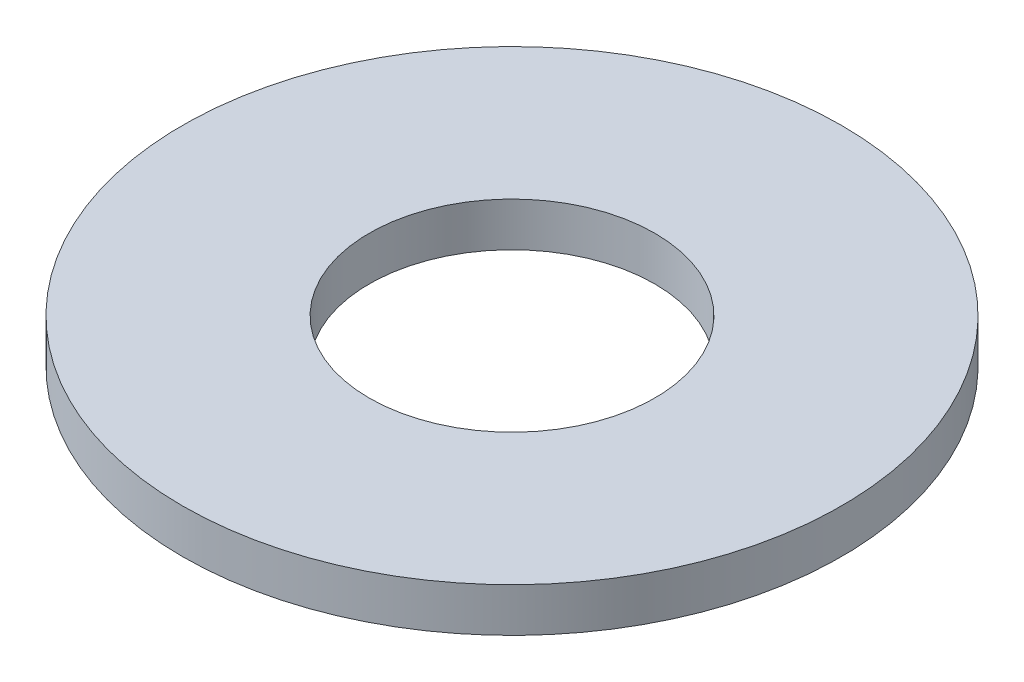
ISO-10303-21;
HEADER;
FILE_DESCRIPTION(('STEP AP214'),'2;1');
FILE_NAME('part.step','',(''),(''),'','','');
FILE_SCHEMA(('AUTOMOTIVE_DESIGN { 1 0 10303 214 1 1 1 1 }'));
ENDSEC;
DATA;
#1=APPLICATION_CONTEXT('core data for automotive mechanical design processes');
#2=APPLICATION_PROTOCOL_DEFINITION('international standard','automotive_design',2000,#1);
#3=PRODUCT_CONTEXT('',#1,'mechanical');
#4=PRODUCT('Part','Part','',(#3));
#5=PRODUCT_RELATED_PRODUCT_CATEGORY('part','',(#4));
#6=PRODUCT_DEFINITION_FORMATION('','',#4);
#7=PRODUCT_DEFINITION_CONTEXT('part definition',#1,'design');
#8=PRODUCT_DEFINITION('design','',#6,#7);
#9=PRODUCT_DEFINITION_SHAPE('','',#8);
#10=(LENGTH_UNIT() NAMED_UNIT(*) SI_UNIT(.MILLI.,.METRE.));
#11=(NAMED_UNIT(*) PLANE_ANGLE_UNIT() SI_UNIT($,.RADIAN.));
#12=(NAMED_UNIT(*) SI_UNIT($,.STERADIAN.) SOLID_ANGLE_UNIT());
#13=UNCERTAINTY_MEASURE_WITH_UNIT(LENGTH_MEASURE(1.E-05),#10,'distance_accuracy_value','');
#14=(GEOMETRIC_REPRESENTATION_CONTEXT(3) GLOBAL_UNCERTAINTY_ASSIGNED_CONTEXT((#13)) GLOBAL_UNIT_ASSIGNED_CONTEXT((#10,
#11,#12)) REPRESENTATION_CONTEXT('',''));
#15=CARTESIAN_POINT('',(0.,0.,0.));
#16=DIRECTION('',(0.,0.,1.));
#17=DIRECTION('',(1.,0.,0.));
#18=AXIS2_PLACEMENT_3D('',#15,#16,#17);
#19=CARTESIAN_POINT('',(0.,0.,0.));
#20=DIRECTION('',(0.,1.,0.));
#21=DIRECTION('',(0.,0.,1.));
#22=AXIS2_PLACEMENT_3D('',#19,#20,#21);
#23=PLANE('',#22);
#24=CARTESIAN_POINT('',(0.,0.,0.));
#25=DIRECTION('',(0.,-1.,0.));
#26=DIRECTION('',(0.,0.,-1.));
#27=AXIS2_PLACEMENT_3D('',#24,#25,#26);
#28=CIRCLE('',#27,3.25);
#29=CARTESIAN_POINT('',(0.,0.,-3.25));
#30=VERTEX_POINT('',#29);
#31=EDGE_CURVE('E31',#30,#30,#28,.F.);
#32=ORIENTED_EDGE('',*,*,#31,.T.);
#33=EDGE_LOOP('',(#32));
#34=FACE_BOUND('',#33,.T.);
#35=CARTESIAN_POINT('',(0.,0.,0.));
#36=DIRECTION('',(0.,-1.,0.));
#37=DIRECTION('',(0.,0.,-1.));
#38=AXIS2_PLACEMENT_3D('',#35,#36,#37);
#39=CIRCLE('',#38,7.5);
#40=CARTESIAN_POINT('',(0.,0.,-7.5));
#41=VERTEX_POINT('',#40);
#42=EDGE_CURVE('E18',#41,#41,#39,.F.);
#43=ORIENTED_EDGE('',*,*,#42,.F.);
#44=EDGE_LOOP('',(#43));
#45=FACE_BOUND('',#44,.T.);
#46=ADVANCED_FACE('F15',(#34,#45),#23,.F.);
#47=CARTESIAN_POINT('',(0.,1.,0.));
#48=DIRECTION('',(0.,-1.,0.));
#49=DIRECTION('',(0.,0.,-1.));
#50=AXIS2_PLACEMENT_3D('',#47,#48,#49);
#51=CYLINDRICAL_SURFACE('',#50,7.5);
#52=ORIENTED_EDGE('',*,*,#42,.T.);
#53=EDGE_LOOP('',(#52));
#54=FACE_BOUND('',#53,.T.);
#55=CARTESIAN_POINT('',(0.,1.,0.));
#56=DIRECTION('',(0.,-1.,0.));
#57=DIRECTION('',(0.,0.,-1.));
#58=AXIS2_PLACEMENT_3D('',#55,#56,#57);
#59=CIRCLE('',#58,7.5);
#60=CARTESIAN_POINT('',(0.,1.,-7.5));
#61=VERTEX_POINT('',#60);
#62=EDGE_CURVE('E23',#61,#61,#59,.F.);
#63=ORIENTED_EDGE('',*,*,#62,.F.);
#64=EDGE_LOOP('',(#63));
#65=FACE_BOUND('',#64,.T.);
#66=ADVANCED_FACE('F40',(#54,#65),#51,.T.);
#67=CARTESIAN_POINT('',(0.,1.,0.));
#68=DIRECTION('',(0.,-1.,0.));
#69=DIRECTION('',(0.,0.,-1.));
#70=AXIS2_PLACEMENT_3D('',#67,#68,#69);
#71=CYLINDRICAL_SURFACE('',#70,3.25);
#72=CARTESIAN_POINT('',(0.,1.,0.));
#73=DIRECTION('',(0.,-1.,0.));
#74=DIRECTION('',(0.,0.,-1.));
#75=AXIS2_PLACEMENT_3D('',#72,#73,#74);
#76=CIRCLE('',#75,3.25);
#77=CARTESIAN_POINT('',(0.,1.,-3.25));
#78=VERTEX_POINT('',#77);
#79=EDGE_CURVE('E10',#78,#78,#76,.T.);
#80=ORIENTED_EDGE('',*,*,#79,.F.);
#81=EDGE_LOOP('',(#80));
#82=FACE_BOUND('',#81,.T.);
#83=ORIENTED_EDGE('',*,*,#31,.F.);
#84=EDGE_LOOP('',(#83));
#85=FACE_BOUND('',#84,.T.);
#86=ADVANCED_FACE('F48',(#82,#85),#71,.F.);
#87=CARTESIAN_POINT('',(0.,1.,0.));
#88=DIRECTION('',(0.,1.,0.));
#89=DIRECTION('',(0.,0.,1.));
#90=AXIS2_PLACEMENT_3D('',#87,#88,#89);
#91=PLANE('',#90);
#92=ORIENTED_EDGE('',*,*,#79,.T.);
#93=EDGE_LOOP('',(#92));
#94=FACE_BOUND('',#93,.T.);
#95=ORIENTED_EDGE('',*,*,#62,.T.);
#96=EDGE_LOOP('',(#95));
#97=FACE_BOUND('',#96,.T.);
#98=ADVANCED_FACE('F49',(#94,#97),#91,.T.);
#99=CLOSED_SHELL('',(#46,#66,#86,#98));
#100=MANIFOLD_SOLID_BREP('B1',#99);
#101=ADVANCED_BREP_SHAPE_REPRESENTATION('',(#18,#100),#14);
#102=SHAPE_DEFINITION_REPRESENTATION(#9,#101);
ENDSEC;
END-ISO-10303-21;
